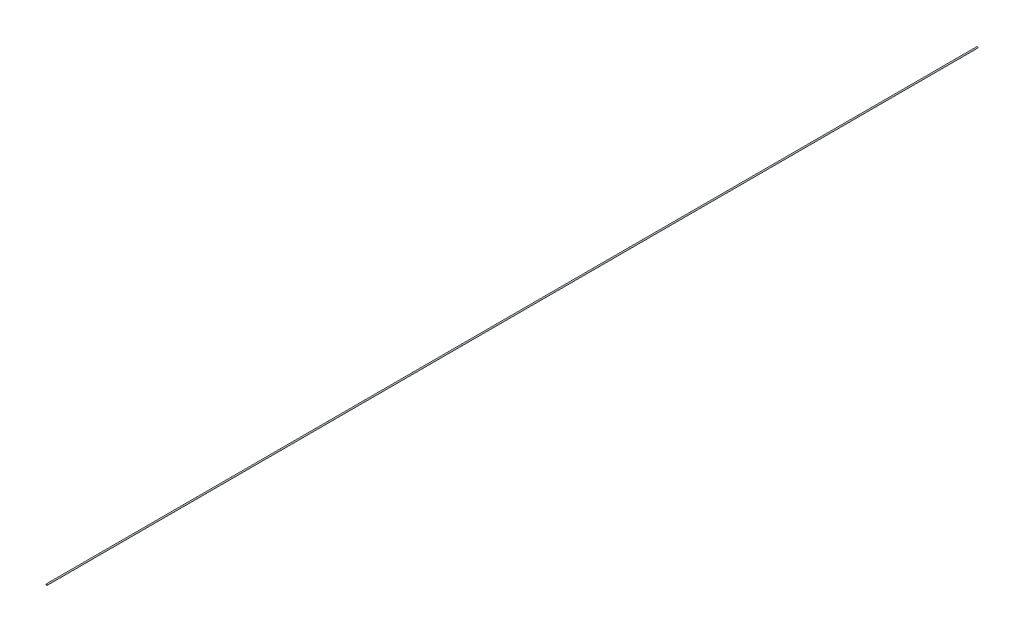
ISO-10303-21;
HEADER;
FILE_DESCRIPTION(('STEP AP214'),'2;1');
FILE_NAME('part.step','',(''),(''),'','','');
FILE_SCHEMA(('AUTOMOTIVE_DESIGN { 1 0 10303 214 1 1 1 1 }'));
ENDSEC;
DATA;
#1=APPLICATION_CONTEXT('core data for automotive mechanical design processes');
#2=APPLICATION_PROTOCOL_DEFINITION('international standard','automotive_design',2000,#1);
#3=PRODUCT_CONTEXT('',#1,'mechanical');
#4=PRODUCT('Part','Part','',(#3));
#5=PRODUCT_RELATED_PRODUCT_CATEGORY('part','',(#4));
#6=PRODUCT_DEFINITION_FORMATION('','',#4);
#7=PRODUCT_DEFINITION_CONTEXT('part definition',#1,'design');
#8=PRODUCT_DEFINITION('design','',#6,#7);
#9=PRODUCT_DEFINITION_SHAPE('','',#8);
#10=(LENGTH_UNIT() NAMED_UNIT(*) SI_UNIT(.MILLI.,.METRE.));
#11=(NAMED_UNIT(*) PLANE_ANGLE_UNIT() SI_UNIT($,.RADIAN.));
#12=(NAMED_UNIT(*) SI_UNIT($,.STERADIAN.) SOLID_ANGLE_UNIT());
#13=UNCERTAINTY_MEASURE_WITH_UNIT(LENGTH_MEASURE(1.E-05),#10,'distance_accuracy_value','');
#14=(GEOMETRIC_REPRESENTATION_CONTEXT(3) GLOBAL_UNCERTAINTY_ASSIGNED_CONTEXT((#13)) GLOBAL_UNIT_ASSIGNED_CONTEXT((#10,
#11,#12)) REPRESENTATION_CONTEXT('',''));
#15=CARTESIAN_POINT('',(0.,0.,0.));
#16=DIRECTION('',(0.,0.,1.));
#17=DIRECTION('',(1.,0.,0.));
#18=AXIS2_PLACEMENT_3D('',#15,#16,#17);
#19=CARTESIAN_POINT('',(0.,0.,4572.));
#20=DIRECTION('',(0.,0.,-1.));
#21=DIRECTION('',(-1.,0.,0.));
#22=AXIS2_PLACEMENT_3D('',#19,#20,#21);
#23=CYLINDRICAL_SURFACE('',#22,3.175);
#24=CARTESIAN_POINT('',(0.,0.,4572.));
#25=DIRECTION('',(0.,0.,1.));
#26=DIRECTION('',(1.,0.,0.));
#27=AXIS2_PLACEMENT_3D('',#24,#25,#26);
#28=CIRCLE('',#27,3.175);
#29=CARTESIAN_POINT('',(3.175,0.,4572.));
#30=VERTEX_POINT('',#29);
#31=EDGE_CURVE('E10',#30,#30,#28,.T.);
#32=ORIENTED_EDGE('',*,*,#31,.F.);
#33=EDGE_LOOP('',(#32));
#34=FACE_BOUND('',#33,.T.);
#35=CARTESIAN_POINT('',(0.,0.,0.));
#36=DIRECTION('',(0.,0.,1.));
#37=DIRECTION('',(1.,0.,0.));
#38=AXIS2_PLACEMENT_3D('',#35,#36,#37);
#39=CIRCLE('',#38,3.175);
#40=CARTESIAN_POINT('',(3.175,0.,0.));
#41=VERTEX_POINT('',#40);
#42=EDGE_CURVE('E36',#41,#41,#39,.T.);
#43=ORIENTED_EDGE('',*,*,#42,.T.);
#44=EDGE_LOOP('',(#43));
#45=FACE_BOUND('',#44,.T.);
#46=ADVANCED_FACE('F33',(#34,#45),#23,.T.);
#47=CARTESIAN_POINT('',(0.,0.,4572.));
#48=DIRECTION('',(0.,0.,1.));
#49=DIRECTION('',(1.,0.,0.));
#50=AXIS2_PLACEMENT_3D('',#47,#48,#49);
#51=PLANE('',#50);
#52=ORIENTED_EDGE('',*,*,#31,.T.);
#53=EDGE_LOOP('',(#52));
#54=FACE_BOUND('',#53,.T.);
#55=ADVANCED_FACE('F48',(#54),#51,.T.);
#56=CARTESIAN_POINT('',(0.,0.,0.));
#57=DIRECTION('',(0.,0.,1.));
#58=DIRECTION('',(1.,0.,0.));
#59=AXIS2_PLACEMENT_3D('',#56,#57,#58);
#60=PLANE('',#59);
#61=ORIENTED_EDGE('',*,*,#42,.F.);
#62=EDGE_LOOP('',(#61));
#63=FACE_BOUND('',#62,.T.);
#64=ADVANCED_FACE('F46',(#63),#60,.F.);
#65=CLOSED_SHELL('',(#46,#55,#64));
#66=MANIFOLD_SOLID_BREP('B2',#65);
#67=ADVANCED_BREP_SHAPE_REPRESENTATION('',(#18,#66),#14);
#68=SHAPE_DEFINITION_REPRESENTATION(#9,#67);
ENDSEC;
END-ISO-10303-21;
